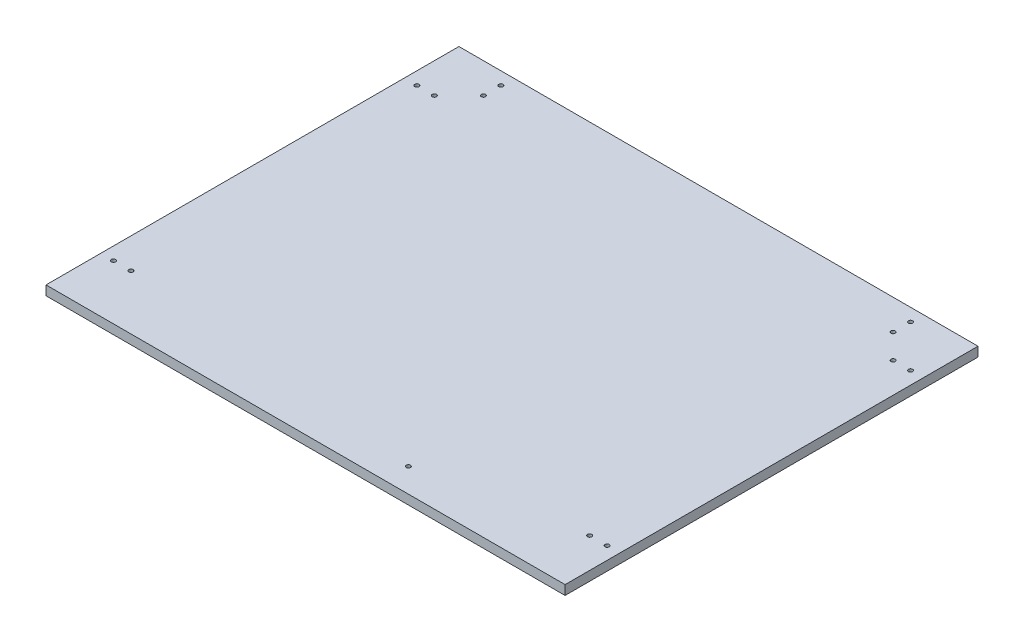
ISO-10303-21;
HEADER;
FILE_DESCRIPTION(('STEP AP214'),'2;1');
FILE_NAME('part.step','',(''),(''),'','','');
FILE_SCHEMA(('AUTOMOTIVE_DESIGN { 1 0 10303 214 1 1 1 1 }'));
ENDSEC;
DATA;
#1=APPLICATION_CONTEXT('core data for automotive mechanical design processes');
#2=APPLICATION_PROTOCOL_DEFINITION('international standard','automotive_design',2000,#1);
#3=PRODUCT_CONTEXT('',#1,'mechanical');
#4=PRODUCT('Part','Part','',(#3));
#5=PRODUCT_RELATED_PRODUCT_CATEGORY('part','',(#4));
#6=PRODUCT_DEFINITION_FORMATION('','',#4);
#7=PRODUCT_DEFINITION_CONTEXT('part definition',#1,'design');
#8=PRODUCT_DEFINITION('design','',#6,#7);
#9=PRODUCT_DEFINITION_SHAPE('','',#8);
#10=(LENGTH_UNIT() NAMED_UNIT(*) SI_UNIT(.MILLI.,.METRE.));
#11=(NAMED_UNIT(*) PLANE_ANGLE_UNIT() SI_UNIT($,.RADIAN.));
#12=(NAMED_UNIT(*) SI_UNIT($,.STERADIAN.) SOLID_ANGLE_UNIT());
#13=UNCERTAINTY_MEASURE_WITH_UNIT(LENGTH_MEASURE(1.E-05),#10,'distance_accuracy_value','');
#14=(GEOMETRIC_REPRESENTATION_CONTEXT(3) GLOBAL_UNCERTAINTY_ASSIGNED_CONTEXT((#13)) GLOBAL_UNIT_ASSIGNED_CONTEXT((#10,
#11,#12)) REPRESENTATION_CONTEXT('',''));
#15=CARTESIAN_POINT('',(0.,0.,0.));
#16=DIRECTION('',(0.,0.,1.));
#17=DIRECTION('',(1.,0.,0.));
#18=AXIS2_PLACEMENT_3D('',#15,#16,#17);
#19=CARTESIAN_POINT('',(-275.,10.,-218.75));
#20=DIRECTION('',(1.,0.,0.));
#21=DIRECTION('',(0.,0.,-1.));
#22=AXIS2_PLACEMENT_3D('',#19,#20,#21);
#23=PLANE('',#22);
#24=DIRECTION('',(0.,0.,1.));
#25=VECTOR('',#24,1.);
#26=CARTESIAN_POINT('',(-275.,0.,-218.75));
#27=LINE('',#26,#25);
#28=CARTESIAN_POINT('',(-275.,0.,-218.75));
#29=VERTEX_POINT('',#28);
#30=CARTESIAN_POINT('',(-275.,0.,218.75));
#31=VERTEX_POINT('',#30);
#32=EDGE_CURVE('E102',#29,#31,#27,.T.);
#33=ORIENTED_EDGE('',*,*,#32,.T.);
#34=DIRECTION('',(0.,-1.,0.));
#35=VECTOR('',#34,1.);
#36=CARTESIAN_POINT('',(-275.,10.,218.75));
#37=LINE('',#36,#35);
#38=CARTESIAN_POINT('',(-275.,10.,218.75));
#39=VERTEX_POINT('',#38);
#40=EDGE_CURVE('E11',#39,#31,#37,.T.);
#41=ORIENTED_EDGE('',*,*,#40,.F.);
#42=DIRECTION('',(0.,0.,1.));
#43=VECTOR('',#42,1.);
#44=CARTESIAN_POINT('',(-275.,10.,-218.75));
#45=LINE('',#44,#43);
#46=CARTESIAN_POINT('',(-275.,10.,-218.75));
#47=VERTEX_POINT('',#46);
#48=EDGE_CURVE('E90',#47,#39,#45,.T.);
#49=ORIENTED_EDGE('',*,*,#48,.F.);
#50=DIRECTION('',(0.,-1.,0.));
#51=VECTOR('',#50,1.);
#52=CARTESIAN_POINT('',(-275.,10.,-218.75));
#53=LINE('',#52,#51);
#54=EDGE_CURVE('E98',#47,#29,#53,.T.);
#55=ORIENTED_EDGE('',*,*,#54,.T.);
#56=EDGE_LOOP('',(#33,#41,#49,#55));
#57=FACE_BOUND('',#56,.T.);
#58=ADVANCED_FACE('F39',(#57),#23,.F.);
#59=CARTESIAN_POINT('',(-275.,10.,218.75));
#60=DIRECTION('',(0.,0.,-1.));
#61=DIRECTION('',(-1.,0.,0.));
#62=AXIS2_PLACEMENT_3D('',#59,#60,#61);
#63=PLANE('',#62);
#64=DIRECTION('',(1.,0.,0.));
#65=VECTOR('',#64,1.);
#66=CARTESIAN_POINT('',(-275.,0.,218.75));
#67=LINE('',#66,#65);
#68=CARTESIAN_POINT('',(275.,0.,218.75));
#69=VERTEX_POINT('',#68);
#70=EDGE_CURVE('E94',#31,#69,#67,.T.);
#71=ORIENTED_EDGE('',*,*,#70,.T.);
#72=DIRECTION('',(0.,-1.,0.));
#73=VECTOR('',#72,1.);
#74=CARTESIAN_POINT('',(275.,10.,218.75));
#75=LINE('',#74,#73);
#76=CARTESIAN_POINT('',(275.,10.,218.75));
#77=VERTEX_POINT('',#76);
#78=EDGE_CURVE('E47',#77,#69,#75,.T.);
#79=ORIENTED_EDGE('',*,*,#78,.F.);
#80=DIRECTION('',(1.,0.,0.));
#81=VECTOR('',#80,1.);
#82=CARTESIAN_POINT('',(-275.,10.,218.75));
#83=LINE('',#82,#81);
#84=EDGE_CURVE('E85',#39,#77,#83,.T.);
#85=ORIENTED_EDGE('',*,*,#84,.F.);
#86=ORIENTED_EDGE('',*,*,#40,.T.);
#87=EDGE_LOOP('',(#71,#79,#85,#86));
#88=FACE_BOUND('',#87,.T.);
#89=ADVANCED_FACE('F93',(#88),#63,.F.);
#90=CARTESIAN_POINT('',(275.,10.,-218.75));
#91=DIRECTION('',(-1.,0.,0.));
#92=DIRECTION('',(0.,0.,1.));
#93=AXIS2_PLACEMENT_3D('',#90,#91,#92);
#94=PLANE('',#93);
#95=DIRECTION('',(0.,0.,-1.));
#96=VECTOR('',#95,1.);
#97=CARTESIAN_POINT('',(275.,0.,-218.75));
#98=LINE('',#97,#96);
#99=CARTESIAN_POINT('',(275.,0.,-218.75));
#100=VERTEX_POINT('',#99);
#101=EDGE_CURVE('E72',#69,#100,#98,.T.);
#102=ORIENTED_EDGE('',*,*,#101,.T.);
#103=DIRECTION('',(0.,-1.,0.));
#104=VECTOR('',#103,1.);
#105=CARTESIAN_POINT('',(275.,10.,-218.75));
#106=LINE('',#105,#104);
#107=CARTESIAN_POINT('',(275.,10.,-218.75));
#108=VERTEX_POINT('',#107);
#109=EDGE_CURVE('E95',#108,#100,#106,.T.);
#110=ORIENTED_EDGE('',*,*,#109,.F.);
#111=DIRECTION('',(0.,0.,-1.));
#112=VECTOR('',#111,1.);
#113=CARTESIAN_POINT('',(275.,10.,-218.75));
#114=LINE('',#113,#112);
#115=EDGE_CURVE('E88',#77,#108,#114,.T.);
#116=ORIENTED_EDGE('',*,*,#115,.F.);
#117=ORIENTED_EDGE('',*,*,#78,.T.);
#118=EDGE_LOOP('',(#102,#110,#116,#117));
#119=FACE_BOUND('',#118,.T.);
#120=ADVANCED_FACE('F96',(#119),#94,.F.);
#121=CARTESIAN_POINT('',(-275.,10.,-218.75));
#122=DIRECTION('',(0.,0.,1.));
#123=DIRECTION('',(1.,0.,0.));
#124=AXIS2_PLACEMENT_3D('',#121,#122,#123);
#125=PLANE('',#124);
#126=DIRECTION('',(-1.,0.,0.));
#127=VECTOR('',#126,1.);
#128=CARTESIAN_POINT('',(-275.,0.,-218.75));
#129=LINE('',#128,#127);
#130=EDGE_CURVE('E78',#100,#29,#129,.T.);
#131=ORIENTED_EDGE('',*,*,#130,.T.);
#132=ORIENTED_EDGE('',*,*,#54,.F.);
#133=DIRECTION('',(-1.,0.,0.));
#134=VECTOR('',#133,1.);
#135=CARTESIAN_POINT('',(-275.,10.,-218.75));
#136=LINE('',#135,#134);
#137=EDGE_CURVE('E55',#108,#47,#136,.T.);
#138=ORIENTED_EDGE('',*,*,#137,.F.);
#139=ORIENTED_EDGE('',*,*,#109,.T.);
#140=EDGE_LOOP('',(#131,#132,#138,#139));
#141=FACE_BOUND('',#140,.T.);
#142=ADVANCED_FACE('F110',(#141),#125,.F.);
#143=CARTESIAN_POINT('',(0.,10.,0.));
#144=DIRECTION('',(0.,1.,0.));
#145=DIRECTION('',(0.,0.,1.));
#146=AXIS2_PLACEMENT_3D('',#143,#144,#145);
#147=PLANE('',#146);
#148=CARTESIAN_POINT('',(-261.5,10.,160.75));
#149=DIRECTION('',(0.,-1.,0.));
#150=DIRECTION('',(0.,0.,-1.));
#151=AXIS2_PLACEMENT_3D('',#148,#149,#150);
#152=CIRCLE('',#151,2.24999999999996);
#153=CARTESIAN_POINT('',(-261.5,10.,158.5));
#154=VERTEX_POINT('',#153);
#155=EDGE_CURVE('E146',#154,#154,#152,.T.);
#156=ORIENTED_EDGE('',*,*,#155,.T.);
#157=EDGE_LOOP('',(#156));
#158=FACE_BOUND('',#157,.T.);
#159=CARTESIAN_POINT('',(-261.5,10.,-160.75));
#160=DIRECTION('',(0.,-1.,0.));
#161=DIRECTION('',(0.,0.,-1.));
#162=AXIS2_PLACEMENT_3D('',#159,#160,#161);
#163=CIRCLE('',#162,2.24999999999996);
#164=CARTESIAN_POINT('',(-261.5,10.,-163.));
#165=VERTEX_POINT('',#164);
#166=EDGE_CURVE('E153',#165,#165,#163,.T.);
#167=ORIENTED_EDGE('',*,*,#166,.T.);
#168=EDGE_LOOP('',(#167));
#169=FACE_BOUND('',#168,.T.);
#170=CARTESIAN_POINT('',(-243.,10.,-160.75));
#171=DIRECTION('',(0.,-1.,0.));
#172=DIRECTION('',(0.,0.,-1.));
#173=AXIS2_PLACEMENT_3D('',#170,#171,#172);
#174=CIRCLE('',#173,2.25000000000001);
#175=CARTESIAN_POINT('',(-243.,10.,-163.));
#176=VERTEX_POINT('',#175);
#177=EDGE_CURVE('E159',#176,#176,#174,.T.);
#178=ORIENTED_EDGE('',*,*,#177,.T.);
#179=EDGE_LOOP('',(#178));
#180=FACE_BOUND('',#179,.T.);
#181=CARTESIAN_POINT('',(-217.,10.,-186.75));
#182=DIRECTION('',(0.,-1.,0.));
#183=DIRECTION('',(0.,0.,-1.));
#184=AXIS2_PLACEMENT_3D('',#181,#182,#183);
#185=CIRCLE('',#184,2.25000000000001);
#186=CARTESIAN_POINT('',(-217.,10.,-189.));
#187=VERTEX_POINT('',#186);
#188=EDGE_CURVE('E165',#187,#187,#185,.T.);
#189=ORIENTED_EDGE('',*,*,#188,.T.);
#190=EDGE_LOOP('',(#189));
#191=FACE_BOUND('',#190,.T.);
#192=CARTESIAN_POINT('',(217.,10.,-186.75));
#193=DIRECTION('',(0.,-1.,0.));
#194=DIRECTION('',(0.,0.,-1.));
#195=AXIS2_PLACEMENT_3D('',#192,#193,#194);
#196=CIRCLE('',#195,2.25000000000001);
#197=CARTESIAN_POINT('',(217.,10.,-189.));
#198=VERTEX_POINT('',#197);
#199=EDGE_CURVE('E129',#198,#198,#196,.T.);
#200=ORIENTED_EDGE('',*,*,#199,.T.);
#201=EDGE_LOOP('',(#200));
#202=FACE_BOUND('',#201,.T.);
#203=CARTESIAN_POINT('',(243.,10.,-160.75));
#204=DIRECTION('',(0.,-1.,0.));
#205=DIRECTION('',(0.,0.,-1.));
#206=AXIS2_PLACEMENT_3D('',#203,#204,#205);
#207=CIRCLE('',#206,2.25000000000001);
#208=CARTESIAN_POINT('',(243.,10.,-163.));
#209=VERTEX_POINT('',#208);
#210=EDGE_CURVE('E122',#209,#209,#207,.T.);
#211=ORIENTED_EDGE('',*,*,#210,.T.);
#212=EDGE_LOOP('',(#211));
#213=FACE_BOUND('',#212,.T.);
#214=CARTESIAN_POINT('',(261.5,10.,-160.75));
#215=DIRECTION('',(0.,-1.,0.));
#216=DIRECTION('',(0.,0.,-1.));
#217=AXIS2_PLACEMENT_3D('',#214,#215,#216);
#218=CIRCLE('',#217,2.24999999999996);
#219=CARTESIAN_POINT('',(261.5,10.,-163.));
#220=VERTEX_POINT('',#219);
#221=EDGE_CURVE('E141',#220,#220,#218,.T.);
#222=ORIENTED_EDGE('',*,*,#221,.T.);
#223=EDGE_LOOP('',(#222));
#224=FACE_BOUND('',#223,.T.);
#225=CARTESIAN_POINT('',(-217.,10.,-205.25));
#226=DIRECTION('',(0.,-1.,0.));
#227=DIRECTION('',(0.,0.,-1.));
#228=AXIS2_PLACEMENT_3D('',#225,#226,#227);
#229=CIRCLE('',#228,2.25000000000001);
#230=CARTESIAN_POINT('',(-217.,10.,-207.5));
#231=VERTEX_POINT('',#230);
#232=EDGE_CURVE('E134',#231,#231,#229,.T.);
#233=ORIENTED_EDGE('',*,*,#232,.T.);
#234=EDGE_LOOP('',(#233));
#235=FACE_BOUND('',#234,.T.);
#236=CARTESIAN_POINT('',(83.5000000000002,10.,193.25));
#237=DIRECTION('',(0.,-1.,0.));
#238=DIRECTION('',(0.,0.,-1.));
#239=AXIS2_PLACEMENT_3D('',#236,#237,#238);
#240=CIRCLE('',#239,2.25);
#241=CARTESIAN_POINT('',(83.5000000000002,10.,191.));
#242=VERTEX_POINT('',#241);
#243=EDGE_CURVE('E182',#242,#242,#240,.T.);
#244=ORIENTED_EDGE('',*,*,#243,.T.);
#245=EDGE_LOOP('',(#244));
#246=FACE_BOUND('',#245,.T.);
#247=CARTESIAN_POINT('',(243.,10.,160.75));
#248=DIRECTION('',(0.,-1.,0.));
#249=DIRECTION('',(0.,0.,-1.));
#250=AXIS2_PLACEMENT_3D('',#247,#248,#249);
#251=CIRCLE('',#250,2.25000000000001);
#252=CARTESIAN_POINT('',(243.,10.,158.5));
#253=VERTEX_POINT('',#252);
#254=EDGE_CURVE('E188',#253,#253,#251,.T.);
#255=ORIENTED_EDGE('',*,*,#254,.T.);
#256=EDGE_LOOP('',(#255));
#257=FACE_BOUND('',#256,.T.);
#258=CARTESIAN_POINT('',(261.5,10.,160.75));
#259=DIRECTION('',(0.,-1.,0.));
#260=DIRECTION('',(0.,0.,-1.));
#261=AXIS2_PLACEMENT_3D('',#258,#259,#260);
#262=CIRCLE('',#261,2.24999999999996);
#263=CARTESIAN_POINT('',(261.5,10.,158.5));
#264=VERTEX_POINT('',#263);
#265=EDGE_CURVE('E170',#264,#264,#262,.T.);
#266=ORIENTED_EDGE('',*,*,#265,.T.);
#267=EDGE_LOOP('',(#266));
#268=FACE_BOUND('',#267,.T.);
#269=CARTESIAN_POINT('',(-243.,10.,160.75));
#270=DIRECTION('',(0.,-1.,0.));
#271=DIRECTION('',(0.,0.,-1.));
#272=AXIS2_PLACEMENT_3D('',#269,#270,#271);
#273=CIRCLE('',#272,2.25000000000001);
#274=CARTESIAN_POINT('',(-243.,10.,158.5));
#275=VERTEX_POINT('',#274);
#276=EDGE_CURVE('E177',#275,#275,#273,.T.);
#277=ORIENTED_EDGE('',*,*,#276,.T.);
#278=EDGE_LOOP('',(#277));
#279=FACE_BOUND('',#278,.T.);
#280=CARTESIAN_POINT('',(217.,10.,-205.25));
#281=DIRECTION('',(0.,-1.,0.));
#282=DIRECTION('',(0.,0.,-1.));
#283=AXIS2_PLACEMENT_3D('',#280,#281,#282);
#284=CIRCLE('',#283,2.25000000000001);
#285=CARTESIAN_POINT('',(217.,10.,-207.5));
#286=VERTEX_POINT('',#285);
#287=EDGE_CURVE('E105',#286,#286,#284,.T.);
#288=ORIENTED_EDGE('',*,*,#287,.T.);
#289=EDGE_LOOP('',(#288));
#290=FACE_BOUND('',#289,.T.);
#291=ORIENTED_EDGE('',*,*,#48,.T.);
#292=ORIENTED_EDGE('',*,*,#84,.T.);
#293=ORIENTED_EDGE('',*,*,#115,.T.);
#294=ORIENTED_EDGE('',*,*,#137,.T.);
#295=EDGE_LOOP('',(#291,#292,#293,#294));
#296=FACE_BOUND('',#295,.T.);
#297=ADVANCED_FACE('F86',(#158,#169,#180,#191,#202,#213,#224,#235,#246,#257,#268,#279,#290,
#296),#147,.T.);
#298=CARTESIAN_POINT('',(0.,0.,0.));
#299=DIRECTION('',(0.,1.,0.));
#300=DIRECTION('',(0.,0.,1.));
#301=AXIS2_PLACEMENT_3D('',#298,#299,#300);
#302=PLANE('',#301);
#303=CARTESIAN_POINT('',(-261.5,0.,160.75));
#304=DIRECTION('',(0.,-1.,0.));
#305=DIRECTION('',(0.,0.,-1.));
#306=AXIS2_PLACEMENT_3D('',#303,#304,#305);
#307=CIRCLE('',#306,2.24999999999996);
#308=CARTESIAN_POINT('',(-261.5,0.,158.5));
#309=VERTEX_POINT('',#308);
#310=EDGE_CURVE('E149',#309,#309,#307,.T.);
#311=ORIENTED_EDGE('',*,*,#310,.F.);
#312=EDGE_LOOP('',(#311));
#313=FACE_BOUND('',#312,.T.);
#314=CARTESIAN_POINT('',(-261.5,0.,-160.75));
#315=DIRECTION('',(0.,-1.,0.));
#316=DIRECTION('',(0.,0.,-1.));
#317=AXIS2_PLACEMENT_3D('',#314,#315,#316);
#318=CIRCLE('',#317,2.24999999999996);
#319=CARTESIAN_POINT('',(-261.5,0.,-163.));
#320=VERTEX_POINT('',#319);
#321=EDGE_CURVE('E156',#320,#320,#318,.T.);
#322=ORIENTED_EDGE('',*,*,#321,.F.);
#323=EDGE_LOOP('',(#322));
#324=FACE_BOUND('',#323,.T.);
#325=CARTESIAN_POINT('',(-243.,0.,-160.75));
#326=DIRECTION('',(0.,-1.,0.));
#327=DIRECTION('',(0.,0.,-1.));
#328=AXIS2_PLACEMENT_3D('',#325,#326,#327);
#329=CIRCLE('',#328,2.25000000000001);
#330=CARTESIAN_POINT('',(-243.,0.,-163.));
#331=VERTEX_POINT('',#330);
#332=EDGE_CURVE('E162',#331,#331,#329,.T.);
#333=ORIENTED_EDGE('',*,*,#332,.F.);
#334=EDGE_LOOP('',(#333));
#335=FACE_BOUND('',#334,.T.);
#336=CARTESIAN_POINT('',(-217.,0.,-186.75));
#337=DIRECTION('',(0.,-1.,0.));
#338=DIRECTION('',(0.,0.,-1.));
#339=AXIS2_PLACEMENT_3D('',#336,#337,#338);
#340=CIRCLE('',#339,2.25000000000001);
#341=CARTESIAN_POINT('',(-217.,0.,-189.));
#342=VERTEX_POINT('',#341);
#343=EDGE_CURVE('E138',#342,#342,#340,.T.);
#344=ORIENTED_EDGE('',*,*,#343,.F.);
#345=EDGE_LOOP('',(#344));
#346=FACE_BOUND('',#345,.T.);
#347=CARTESIAN_POINT('',(217.,0.,-186.75));
#348=DIRECTION('',(0.,-1.,0.));
#349=DIRECTION('',(0.,0.,-1.));
#350=AXIS2_PLACEMENT_3D('',#347,#348,#349);
#351=CIRCLE('',#350,2.25000000000001);
#352=CARTESIAN_POINT('',(217.,0.,-189.));
#353=VERTEX_POINT('',#352);
#354=EDGE_CURVE('E119',#353,#353,#351,.T.);
#355=ORIENTED_EDGE('',*,*,#354,.F.);
#356=EDGE_LOOP('',(#355));
#357=FACE_BOUND('',#356,.T.);
#358=CARTESIAN_POINT('',(243.,0.,-160.75));
#359=DIRECTION('',(0.,-1.,0.));
#360=DIRECTION('',(0.,0.,-1.));
#361=AXIS2_PLACEMENT_3D('',#358,#359,#360);
#362=CIRCLE('',#361,2.25000000000001);
#363=CARTESIAN_POINT('',(243.,0.,-163.));
#364=VERTEX_POINT('',#363);
#365=EDGE_CURVE('E125',#364,#364,#362,.T.);
#366=ORIENTED_EDGE('',*,*,#365,.F.);
#367=EDGE_LOOP('',(#366));
#368=FACE_BOUND('',#367,.T.);
#369=CARTESIAN_POINT('',(261.5,0.,-160.75));
#370=DIRECTION('',(0.,-1.,0.));
#371=DIRECTION('',(0.,0.,-1.));
#372=AXIS2_PLACEMENT_3D('',#369,#370,#371);
#373=CIRCLE('',#372,2.24999999999996);
#374=CARTESIAN_POINT('',(261.5,0.,-163.));
#375=VERTEX_POINT('',#374);
#376=EDGE_CURVE('E126',#375,#375,#373,.T.);
#377=ORIENTED_EDGE('',*,*,#376,.F.);
#378=EDGE_LOOP('',(#377));
#379=FACE_BOUND('',#378,.T.);
#380=CARTESIAN_POINT('',(-217.,0.,-205.25));
#381=DIRECTION('',(0.,-1.,0.));
#382=DIRECTION('',(0.,0.,-1.));
#383=AXIS2_PLACEMENT_3D('',#380,#381,#382);
#384=CIRCLE('',#383,2.25000000000001);
#385=CARTESIAN_POINT('',(-217.,0.,-207.5));
#386=VERTEX_POINT('',#385);
#387=EDGE_CURVE('E137',#386,#386,#384,.T.);
#388=ORIENTED_EDGE('',*,*,#387,.F.);
#389=EDGE_LOOP('',(#388));
#390=FACE_BOUND('',#389,.T.);
#391=CARTESIAN_POINT('',(83.5000000000002,0.,193.25));
#392=DIRECTION('',(0.,-1.,0.));
#393=DIRECTION('',(0.,0.,-1.));
#394=AXIS2_PLACEMENT_3D('',#391,#392,#393);
#395=CIRCLE('',#394,2.25);
#396=CARTESIAN_POINT('',(83.5000000000002,0.,191.));
#397=VERTEX_POINT('',#396);
#398=EDGE_CURVE('E185',#397,#397,#395,.T.);
#399=ORIENTED_EDGE('',*,*,#398,.F.);
#400=EDGE_LOOP('',(#399));
#401=FACE_BOUND('',#400,.T.);
#402=CARTESIAN_POINT('',(243.,0.,160.75));
#403=DIRECTION('',(0.,-1.,0.));
#404=DIRECTION('',(0.,0.,-1.));
#405=AXIS2_PLACEMENT_3D('',#402,#403,#404);
#406=CIRCLE('',#405,2.25000000000001);
#407=CARTESIAN_POINT('',(243.,0.,158.5));
#408=VERTEX_POINT('',#407);
#409=EDGE_CURVE('E174',#408,#408,#406,.T.);
#410=ORIENTED_EDGE('',*,*,#409,.F.);
#411=EDGE_LOOP('',(#410));
#412=FACE_BOUND('',#411,.T.);
#413=CARTESIAN_POINT('',(261.5,0.,160.75));
#414=DIRECTION('',(0.,-1.,0.));
#415=DIRECTION('',(0.,0.,-1.));
#416=AXIS2_PLACEMENT_3D('',#413,#414,#415);
#417=CIRCLE('',#416,2.24999999999996);
#418=CARTESIAN_POINT('',(261.5,0.,158.5));
#419=VERTEX_POINT('',#418);
#420=EDGE_CURVE('E173',#419,#419,#417,.T.);
#421=ORIENTED_EDGE('',*,*,#420,.F.);
#422=EDGE_LOOP('',(#421));
#423=FACE_BOUND('',#422,.T.);
#424=CARTESIAN_POINT('',(-243.,0.,160.75));
#425=DIRECTION('',(0.,-1.,0.));
#426=DIRECTION('',(0.,0.,-1.));
#427=AXIS2_PLACEMENT_3D('',#424,#425,#426);
#428=CIRCLE('',#427,2.25000000000001);
#429=CARTESIAN_POINT('',(-243.,0.,158.5));
#430=VERTEX_POINT('',#429);
#431=EDGE_CURVE('E150',#430,#430,#428,.T.);
#432=ORIENTED_EDGE('',*,*,#431,.F.);
#433=EDGE_LOOP('',(#432));
#434=FACE_BOUND('',#433,.T.);
#435=CARTESIAN_POINT('',(217.,0.,-205.25));
#436=DIRECTION('',(0.,-1.,0.));
#437=DIRECTION('',(0.,0.,-1.));
#438=AXIS2_PLACEMENT_3D('',#435,#436,#437);
#439=CIRCLE('',#438,2.25000000000001);
#440=CARTESIAN_POINT('',(217.,0.,-207.5));
#441=VERTEX_POINT('',#440);
#442=EDGE_CURVE('E116',#441,#441,#439,.T.);
#443=ORIENTED_EDGE('',*,*,#442,.F.);
#444=EDGE_LOOP('',(#443));
#445=FACE_BOUND('',#444,.T.);
#446=ORIENTED_EDGE('',*,*,#32,.F.);
#447=ORIENTED_EDGE('',*,*,#130,.F.);
#448=ORIENTED_EDGE('',*,*,#101,.F.);
#449=ORIENTED_EDGE('',*,*,#70,.F.);
#450=EDGE_LOOP('',(#446,#447,#448,#449));
#451=FACE_BOUND('',#450,.T.);
#452=ADVANCED_FACE('F113',(#313,#324,#335,#346,#357,#368,#379,#390,#401,#412,#423,#434,#445,
#451),#302,.F.);
#453=CARTESIAN_POINT('',(217.,10.,-205.25));
#454=DIRECTION('',(0.,-1.,0.));
#455=DIRECTION('',(0.,0.,-1.));
#456=AXIS2_PLACEMENT_3D('',#453,#454,#455);
#457=CYLINDRICAL_SURFACE('',#456,2.25000000000001);
#458=ORIENTED_EDGE('',*,*,#287,.F.);
#459=EDGE_LOOP('',(#458));
#460=FACE_BOUND('',#459,.T.);
#461=ORIENTED_EDGE('',*,*,#442,.T.);
#462=EDGE_LOOP('',(#461));
#463=FACE_BOUND('',#462,.T.);
#464=ADVANCED_FACE('F198',(#460,#463),#457,.F.);
#465=CARTESIAN_POINT('',(-243.,10.,160.75));
#466=DIRECTION('',(0.,-1.,0.));
#467=DIRECTION('',(0.,0.,-1.));
#468=AXIS2_PLACEMENT_3D('',#465,#466,#467);
#469=CYLINDRICAL_SURFACE('',#468,2.25000000000001);
#470=ORIENTED_EDGE('',*,*,#276,.F.);
#471=EDGE_LOOP('',(#470));
#472=FACE_BOUND('',#471,.T.);
#473=ORIENTED_EDGE('',*,*,#431,.T.);
#474=EDGE_LOOP('',(#473));
#475=FACE_BOUND('',#474,.T.);
#476=ADVANCED_FACE('F208',(#472,#475),#469,.F.);
#477=CARTESIAN_POINT('',(261.5,10.,160.75));
#478=DIRECTION('',(0.,-1.,0.));
#479=DIRECTION('',(0.,0.,-1.));
#480=AXIS2_PLACEMENT_3D('',#477,#478,#479);
#481=CYLINDRICAL_SURFACE('',#480,2.24999999999996);
#482=ORIENTED_EDGE('',*,*,#265,.F.);
#483=EDGE_LOOP('',(#482));
#484=FACE_BOUND('',#483,.T.);
#485=ORIENTED_EDGE('',*,*,#420,.T.);
#486=EDGE_LOOP('',(#485));
#487=FACE_BOUND('',#486,.T.);
#488=ADVANCED_FACE('F214',(#484,#487),#481,.F.);
#489=CARTESIAN_POINT('',(243.,10.,160.75));
#490=DIRECTION('',(0.,-1.,0.));
#491=DIRECTION('',(0.,0.,-1.));
#492=AXIS2_PLACEMENT_3D('',#489,#490,#491);
#493=CYLINDRICAL_SURFACE('',#492,2.25000000000001);
#494=ORIENTED_EDGE('',*,*,#254,.F.);
#495=EDGE_LOOP('',(#494));
#496=FACE_BOUND('',#495,.T.);
#497=ORIENTED_EDGE('',*,*,#409,.T.);
#498=EDGE_LOOP('',(#497));
#499=FACE_BOUND('',#498,.T.);
#500=ADVANCED_FACE('F194',(#496,#499),#493,.F.);
#501=CARTESIAN_POINT('',(83.5000000000002,10.,193.25));
#502=DIRECTION('',(0.,-1.,0.));
#503=DIRECTION('',(0.,0.,-1.));
#504=AXIS2_PLACEMENT_3D('',#501,#502,#503);
#505=CYLINDRICAL_SURFACE('',#504,2.25);
#506=ORIENTED_EDGE('',*,*,#243,.F.);
#507=EDGE_LOOP('',(#506));
#508=FACE_BOUND('',#507,.T.);
#509=ORIENTED_EDGE('',*,*,#398,.T.);
#510=EDGE_LOOP('',(#509));
#511=FACE_BOUND('',#510,.T.);
#512=ADVANCED_FACE('F266',(#508,#511),#505,.F.);
#513=CARTESIAN_POINT('',(-217.,10.,-205.25));
#514=DIRECTION('',(0.,-1.,0.));
#515=DIRECTION('',(0.,0.,-1.));
#516=AXIS2_PLACEMENT_3D('',#513,#514,#515);
#517=CYLINDRICAL_SURFACE('',#516,2.25000000000001);
#518=ORIENTED_EDGE('',*,*,#232,.F.);
#519=EDGE_LOOP('',(#518));
#520=FACE_BOUND('',#519,.T.);
#521=ORIENTED_EDGE('',*,*,#387,.T.);
#522=EDGE_LOOP('',(#521));
#523=FACE_BOUND('',#522,.T.);
#524=ADVANCED_FACE('F292',(#520,#523),#517,.F.);
#525=CARTESIAN_POINT('',(261.5,10.,-160.75));
#526=DIRECTION('',(0.,-1.,0.));
#527=DIRECTION('',(0.,0.,-1.));
#528=AXIS2_PLACEMENT_3D('',#525,#526,#527);
#529=CYLINDRICAL_SURFACE('',#528,2.24999999999996);
#530=ORIENTED_EDGE('',*,*,#221,.F.);
#531=EDGE_LOOP('',(#530));
#532=FACE_BOUND('',#531,.T.);
#533=ORIENTED_EDGE('',*,*,#376,.T.);
#534=EDGE_LOOP('',(#533));
#535=FACE_BOUND('',#534,.T.);
#536=ADVANCED_FACE('F288',(#532,#535),#529,.F.);
#537=CARTESIAN_POINT('',(243.,10.,-160.75));
#538=DIRECTION('',(0.,-1.,0.));
#539=DIRECTION('',(0.,0.,-1.));
#540=AXIS2_PLACEMENT_3D('',#537,#538,#539);
#541=CYLINDRICAL_SURFACE('',#540,2.25000000000001);
#542=ORIENTED_EDGE('',*,*,#210,.F.);
#543=EDGE_LOOP('',(#542));
#544=FACE_BOUND('',#543,.T.);
#545=ORIENTED_EDGE('',*,*,#365,.T.);
#546=EDGE_LOOP('',(#545));
#547=FACE_BOUND('',#546,.T.);
#548=ADVANCED_FACE('F291',(#544,#547),#541,.F.);
#549=CARTESIAN_POINT('',(217.,10.,-186.75));
#550=DIRECTION('',(0.,-1.,0.));
#551=DIRECTION('',(0.,0.,-1.));
#552=AXIS2_PLACEMENT_3D('',#549,#550,#551);
#553=CYLINDRICAL_SURFACE('',#552,2.25000000000001);
#554=ORIENTED_EDGE('',*,*,#199,.F.);
#555=EDGE_LOOP('',(#554));
#556=FACE_BOUND('',#555,.T.);
#557=ORIENTED_EDGE('',*,*,#354,.T.);
#558=EDGE_LOOP('',(#557));
#559=FACE_BOUND('',#558,.T.);
#560=ADVANCED_FACE('F275',(#556,#559),#553,.F.);
#561=CARTESIAN_POINT('',(-217.,10.,-186.75));
#562=DIRECTION('',(0.,-1.,0.));
#563=DIRECTION('',(0.,0.,-1.));
#564=AXIS2_PLACEMENT_3D('',#561,#562,#563);
#565=CYLINDRICAL_SURFACE('',#564,2.25000000000001);
#566=ORIENTED_EDGE('',*,*,#188,.F.);
#567=EDGE_LOOP('',(#566));
#568=FACE_BOUND('',#567,.T.);
#569=ORIENTED_EDGE('',*,*,#343,.T.);
#570=EDGE_LOOP('',(#569));
#571=FACE_BOUND('',#570,.T.);
#572=ADVANCED_FACE('F271',(#568,#571),#565,.F.);
#573=CARTESIAN_POINT('',(-243.,10.,-160.75));
#574=DIRECTION('',(0.,-1.,0.));
#575=DIRECTION('',(0.,0.,-1.));
#576=AXIS2_PLACEMENT_3D('',#573,#574,#575);
#577=CYLINDRICAL_SURFACE('',#576,2.25000000000001);
#578=ORIENTED_EDGE('',*,*,#177,.F.);
#579=EDGE_LOOP('',(#578));
#580=FACE_BOUND('',#579,.T.);
#581=ORIENTED_EDGE('',*,*,#332,.T.);
#582=EDGE_LOOP('',(#581));
#583=FACE_BOUND('',#582,.T.);
#584=ADVANCED_FACE('F274',(#580,#583),#577,.F.);
#585=CARTESIAN_POINT('',(-261.5,10.,-160.75));
#586=DIRECTION('',(0.,-1.,0.));
#587=DIRECTION('',(0.,0.,-1.));
#588=AXIS2_PLACEMENT_3D('',#585,#586,#587);
#589=CYLINDRICAL_SURFACE('',#588,2.24999999999996);
#590=ORIENTED_EDGE('',*,*,#166,.F.);
#591=EDGE_LOOP('',(#590));
#592=FACE_BOUND('',#591,.T.);
#593=ORIENTED_EDGE('',*,*,#321,.T.);
#594=EDGE_LOOP('',(#593));
#595=FACE_BOUND('',#594,.T.);
#596=ADVANCED_FACE('F279',(#592,#595),#589,.F.);
#597=CARTESIAN_POINT('',(-261.5,10.,160.75));
#598=DIRECTION('',(0.,-1.,0.));
#599=DIRECTION('',(0.,0.,-1.));
#600=AXIS2_PLACEMENT_3D('',#597,#598,#599);
#601=CYLINDRICAL_SURFACE('',#600,2.24999999999996);
#602=ORIENTED_EDGE('',*,*,#155,.F.);
#603=EDGE_LOOP('',(#602));
#604=FACE_BOUND('',#603,.T.);
#605=ORIENTED_EDGE('',*,*,#310,.T.);
#606=EDGE_LOOP('',(#605));
#607=FACE_BOUND('',#606,.T.);
#608=ADVANCED_FACE('F283',(#604,#607),#601,.F.);
#609=CLOSED_SHELL('',(#58,#89,#120,#142,#297,#452,#464,#476,#488,#500,#512,#524,#536,#548,#560,
#572,#584,#596,#608));
#610=MANIFOLD_SOLID_BREP('B2',#609);
#611=ADVANCED_BREP_SHAPE_REPRESENTATION('',(#18,#610),#14);
#612=SHAPE_DEFINITION_REPRESENTATION(#9,#611);
ENDSEC;
END-ISO-10303-21;
